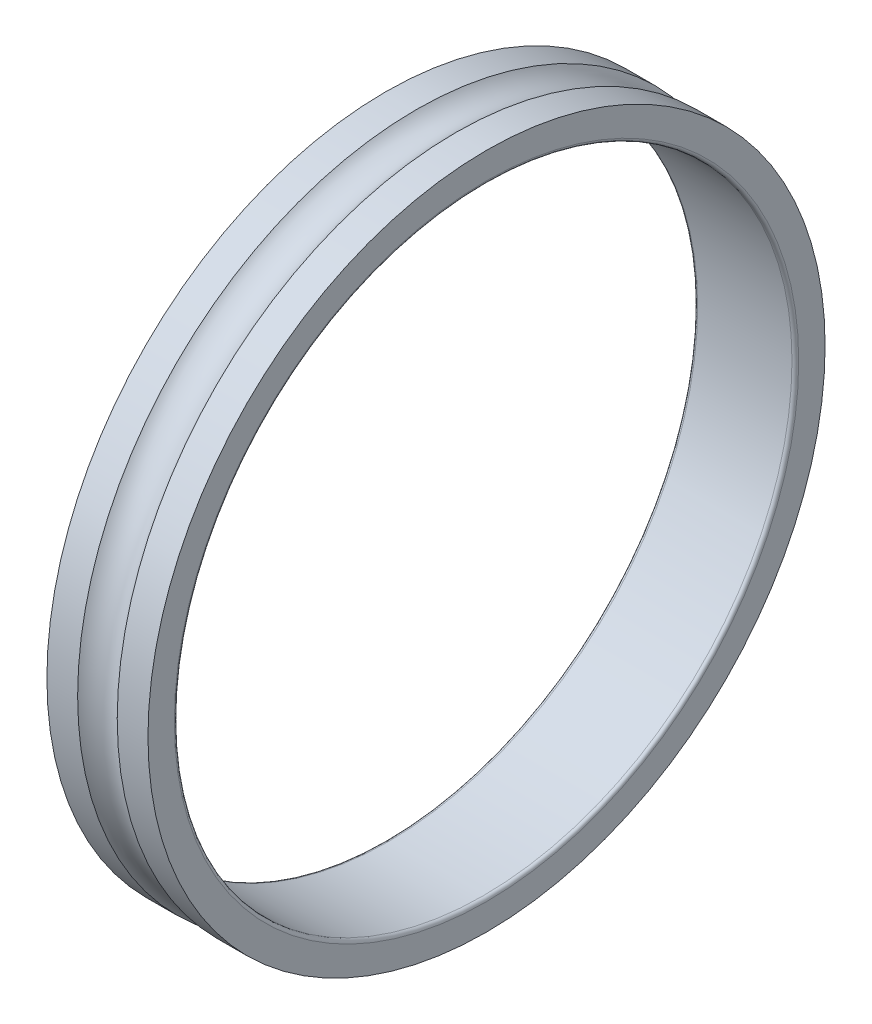
ISO-10303-21;
HEADER;
FILE_DESCRIPTION(('STEP AP214'),'2;1');
FILE_NAME('part.step','',(''),(''),'','','');
FILE_SCHEMA(('AUTOMOTIVE_DESIGN { 1 0 10303 214 1 1 1 1 }'));
ENDSEC;
DATA;
#1=APPLICATION_CONTEXT('core data for automotive mechanical design processes');
#2=APPLICATION_PROTOCOL_DEFINITION('international standard','automotive_design',2000,#1);
#3=PRODUCT_CONTEXT('',#1,'mechanical');
#4=PRODUCT('Part','Part','',(#3));
#5=PRODUCT_RELATED_PRODUCT_CATEGORY('part','',(#4));
#6=PRODUCT_DEFINITION_FORMATION('','',#4);
#7=PRODUCT_DEFINITION_CONTEXT('part definition',#1,'design');
#8=PRODUCT_DEFINITION('design','',#6,#7);
#9=PRODUCT_DEFINITION_SHAPE('','',#8);
#10=(LENGTH_UNIT() NAMED_UNIT(*) SI_UNIT(.MILLI.,.METRE.));
#11=(NAMED_UNIT(*) PLANE_ANGLE_UNIT() SI_UNIT($,.RADIAN.));
#12=(NAMED_UNIT(*) SI_UNIT($,.STERADIAN.) SOLID_ANGLE_UNIT());
#13=UNCERTAINTY_MEASURE_WITH_UNIT(LENGTH_MEASURE(1.E-05),#10,'distance_accuracy_value','');
#14=(GEOMETRIC_REPRESENTATION_CONTEXT(3) GLOBAL_UNCERTAINTY_ASSIGNED_CONTEXT((#13)) GLOBAL_UNIT_ASSIGNED_CONTEXT((#10,
#11,#12)) REPRESENTATION_CONTEXT('',''));
#15=CARTESIAN_POINT('',(0.,0.,0.));
#16=DIRECTION('',(0.,0.,1.));
#17=DIRECTION('',(1.,0.,0.));
#18=AXIS2_PLACEMENT_3D('',#15,#16,#17);
#19=CARTESIAN_POINT('',(7.63164065809148,0.,0.));
#20=DIRECTION('',(-1.,0.,0.));
#21=DIRECTION('',(0.,1.,0.));
#22=AXIS2_PLACEMENT_3D('',#19,#20,#21);
#23=CYLINDRICAL_SURFACE('',#22,30.15);
#24=CARTESIAN_POINT('',(6.26328131618297,0.,0.));
#25=DIRECTION('',(1.,0.,0.));
#26=DIRECTION('',(0.,1.,0.));
#27=AXIS2_PLACEMENT_3D('',#24,#25,#26);
#28=CIRCLE('',#27,30.15);
#29=CARTESIAN_POINT('',(6.26328131618297,30.15,0.));
#30=VERTEX_POINT('',#29);
#31=EDGE_CURVE('E11',#30,#30,#28,.T.);
#32=ORIENTED_EDGE('',*,*,#31,.T.);
#33=EDGE_LOOP('',(#32));
#34=FACE_BOUND('',#33,.T.);
#35=CARTESIAN_POINT('',(9.,0.,0.));
#36=DIRECTION('',(1.,0.,0.));
#37=DIRECTION('',(0.,1.,0.));
#38=AXIS2_PLACEMENT_3D('',#35,#36,#37);
#39=CIRCLE('',#38,30.15);
#40=CARTESIAN_POINT('',(9.,30.15,0.));
#41=VERTEX_POINT('',#40);
#42=EDGE_CURVE('E49',#41,#41,#39,.T.);
#43=ORIENTED_EDGE('',*,*,#42,.F.);
#44=EDGE_LOOP('',(#43));
#45=FACE_BOUND('',#44,.T.);
#46=ADVANCED_FACE('F16',(#34,#45),#23,.T.);
#47=CARTESIAN_POINT('',(4.5,0.,0.));
#48=DIRECTION('',(1.,0.,0.));
#49=DIRECTION('',(0.,0.,-1.));
#50=AXIS2_PLACEMENT_3D('',#47,#48,#49);
#51=TOROIDAL_SURFACE('',#50,31.75,2.381);
#52=CARTESIAN_POINT('',(2.73671868381702,0.,0.));
#53=DIRECTION('',(1.,0.,0.));
#54=DIRECTION('',(0.,1.,0.));
#55=AXIS2_PLACEMENT_3D('',#52,#53,#54);
#56=CIRCLE('',#55,30.15);
#57=CARTESIAN_POINT('',(2.73671868381702,30.15,0.));
#58=VERTEX_POINT('',#57);
#59=EDGE_CURVE('E25',#58,#58,#56,.T.);
#60=ORIENTED_EDGE('',*,*,#59,.T.);
#61=EDGE_LOOP('',(#60));
#62=FACE_BOUND('',#61,.T.);
#63=ORIENTED_EDGE('',*,*,#31,.F.);
#64=EDGE_LOOP('',(#63));
#65=FACE_BOUND('',#64,.T.);
#66=ADVANCED_FACE('F90',(#62,#65),#51,.F.);
#67=CARTESIAN_POINT('',(1.36835934190851,0.,0.));
#68=DIRECTION('',(-1.,0.,0.));
#69=DIRECTION('',(0.,1.,0.));
#70=AXIS2_PLACEMENT_3D('',#67,#68,#69);
#71=CYLINDRICAL_SURFACE('',#70,30.15);
#72=CARTESIAN_POINT('',(0.,0.,0.));
#73=DIRECTION('',(1.,0.,0.));
#74=DIRECTION('',(0.,1.,0.));
#75=AXIS2_PLACEMENT_3D('',#72,#73,#74);
#76=CIRCLE('',#75,30.15);
#77=CARTESIAN_POINT('',(0.,30.15,0.));
#78=VERTEX_POINT('',#77);
#79=EDGE_CURVE('E59',#78,#78,#76,.T.);
#80=ORIENTED_EDGE('',*,*,#79,.T.);
#81=EDGE_LOOP('',(#80));
#82=FACE_BOUND('',#81,.T.);
#83=ORIENTED_EDGE('',*,*,#59,.F.);
#84=EDGE_LOOP('',(#83));
#85=FACE_BOUND('',#84,.T.);
#86=ADVANCED_FACE('F60',(#82,#85),#71,.T.);
#87=CARTESIAN_POINT('',(0.,28.975,0.));
#88=DIRECTION('',(-1.,0.,0.));
#89=DIRECTION('',(0.,-1.,0.));
#90=AXIS2_PLACEMENT_3D('',#87,#88,#89);
#91=PLANE('',#90);
#92=CARTESIAN_POINT('',(0.,0.,0.));
#93=DIRECTION('',(1.,0.,0.));
#94=DIRECTION('',(0.,1.,0.));
#95=AXIS2_PLACEMENT_3D('',#92,#93,#94);
#96=CIRCLE('',#95,27.8);
#97=CARTESIAN_POINT('',(0.,27.8,0.));
#98=VERTEX_POINT('',#97);
#99=EDGE_CURVE('E55',#98,#98,#96,.T.);
#100=ORIENTED_EDGE('',*,*,#99,.T.);
#101=EDGE_LOOP('',(#100));
#102=FACE_BOUND('',#101,.T.);
#103=ORIENTED_EDGE('',*,*,#79,.F.);
#104=EDGE_LOOP('',(#103));
#105=FACE_BOUND('',#104,.T.);
#106=ADVANCED_FACE('F86',(#102,#105),#91,.T.);
#107=CARTESIAN_POINT('',(0.3,0.,0.));
#108=DIRECTION('',(1.,0.,0.));
#109=DIRECTION('',(0.,0.,-1.));
#110=AXIS2_PLACEMENT_3D('',#107,#108,#109);
#111=TOROIDAL_SURFACE('',#110,27.8,0.3);
#112=CARTESIAN_POINT('',(0.3,0.,0.));
#113=DIRECTION('',(1.,0.,0.));
#114=DIRECTION('',(0.,1.,0.));
#115=AXIS2_PLACEMENT_3D('',#112,#113,#114);
#116=CIRCLE('',#115,27.5);
#117=CARTESIAN_POINT('',(0.3,27.5,0.));
#118=VERTEX_POINT('',#117);
#119=EDGE_CURVE('E19',#118,#118,#116,.T.);
#120=ORIENTED_EDGE('',*,*,#119,.T.);
#121=EDGE_LOOP('',(#120));
#122=FACE_BOUND('',#121,.T.);
#123=ORIENTED_EDGE('',*,*,#99,.F.);
#124=EDGE_LOOP('',(#123));
#125=FACE_BOUND('',#124,.T.);
#126=ADVANCED_FACE('F71',(#122,#125),#111,.T.);
#127=CARTESIAN_POINT('',(4.5,0.,0.));
#128=DIRECTION('',(-1.,0.,0.));
#129=DIRECTION('',(0.,1.,0.));
#130=AXIS2_PLACEMENT_3D('',#127,#128,#129);
#131=CYLINDRICAL_SURFACE('',#130,27.5);
#132=CARTESIAN_POINT('',(8.7,0.,0.));
#133=DIRECTION('',(1.,0.,0.));
#134=DIRECTION('',(0.,1.,0.));
#135=AXIS2_PLACEMENT_3D('',#132,#133,#134);
#136=CIRCLE('',#135,27.5);
#137=CARTESIAN_POINT('',(8.7,27.5,0.));
#138=VERTEX_POINT('',#137);
#139=EDGE_CURVE('E41',#138,#138,#136,.T.);
#140=ORIENTED_EDGE('',*,*,#139,.T.);
#141=EDGE_LOOP('',(#140));
#142=FACE_BOUND('',#141,.T.);
#143=ORIENTED_EDGE('',*,*,#119,.F.);
#144=EDGE_LOOP('',(#143));
#145=FACE_BOUND('',#144,.T.);
#146=ADVANCED_FACE('F74',(#142,#145),#131,.F.);
#147=CARTESIAN_POINT('',(8.7,0.,0.));
#148=DIRECTION('',(1.,0.,0.));
#149=DIRECTION('',(0.,0.,-1.));
#150=AXIS2_PLACEMENT_3D('',#147,#148,#149);
#151=TOROIDAL_SURFACE('',#150,27.8,0.3);
#152=CARTESIAN_POINT('',(9.,0.,0.));
#153=DIRECTION('',(1.,0.,0.));
#154=DIRECTION('',(0.,1.,0.));
#155=AXIS2_PLACEMENT_3D('',#152,#153,#154);
#156=CIRCLE('',#155,27.8);
#157=CARTESIAN_POINT('',(9.,27.8,0.));
#158=VERTEX_POINT('',#157);
#159=EDGE_CURVE('E67',#158,#158,#156,.T.);
#160=ORIENTED_EDGE('',*,*,#159,.T.);
#161=EDGE_LOOP('',(#160));
#162=FACE_BOUND('',#161,.T.);
#163=ORIENTED_EDGE('',*,*,#139,.F.);
#164=EDGE_LOOP('',(#163));
#165=FACE_BOUND('',#164,.T.);
#166=ADVANCED_FACE('F76',(#162,#165),#151,.T.);
#167=CARTESIAN_POINT('',(9.,28.975,0.));
#168=DIRECTION('',(1.,0.,0.));
#169=DIRECTION('',(0.,1.,0.));
#170=AXIS2_PLACEMENT_3D('',#167,#168,#169);
#171=PLANE('',#170);
#172=ORIENTED_EDGE('',*,*,#42,.T.);
#173=EDGE_LOOP('',(#172));
#174=FACE_BOUND('',#173,.T.);
#175=ORIENTED_EDGE('',*,*,#159,.F.);
#176=EDGE_LOOP('',(#175));
#177=FACE_BOUND('',#176,.T.);
#178=ADVANCED_FACE('F83',(#174,#177),#171,.T.);
#179=CLOSED_SHELL('',(#46,#66,#86,#106,#126,#146,#166,#178));
#180=MANIFOLD_SOLID_BREP('B1',#179);
#181=ADVANCED_BREP_SHAPE_REPRESENTATION('',(#18,#180),#14);
#182=SHAPE_DEFINITION_REPRESENTATION(#9,#181);
ENDSEC;
END-ISO-10303-21;
